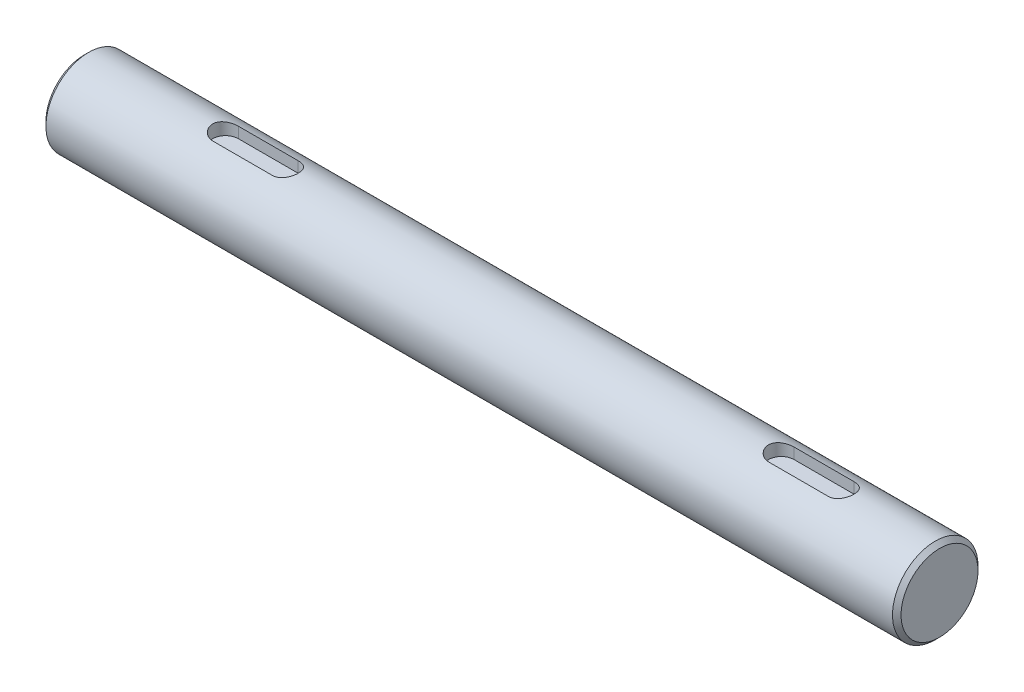
ISO-10303-21;
HEADER;
FILE_DESCRIPTION(('STEP AP214'),'2;1');
FILE_NAME('part.step','',(''),(''),'','','');
FILE_SCHEMA(('AUTOMOTIVE_DESIGN { 1 0 10303 214 1 1 1 1 }'));
ENDSEC;
DATA;
#1=APPLICATION_CONTEXT('core data for automotive mechanical design processes');
#2=APPLICATION_PROTOCOL_DEFINITION('international standard','automotive_design',2000,#1);
#3=PRODUCT_CONTEXT('',#1,'mechanical');
#4=PRODUCT('Part','Part','',(#3));
#5=PRODUCT_RELATED_PRODUCT_CATEGORY('part','',(#4));
#6=PRODUCT_DEFINITION_FORMATION('','',#4);
#7=PRODUCT_DEFINITION_CONTEXT('part definition',#1,'design');
#8=PRODUCT_DEFINITION('design','',#6,#7);
#9=PRODUCT_DEFINITION_SHAPE('','',#8);
#10=(LENGTH_UNIT() NAMED_UNIT(*) SI_UNIT(.MILLI.,.METRE.));
#11=(NAMED_UNIT(*) PLANE_ANGLE_UNIT() SI_UNIT($,.RADIAN.));
#12=(NAMED_UNIT(*) SI_UNIT($,.STERADIAN.) SOLID_ANGLE_UNIT());
#13=UNCERTAINTY_MEASURE_WITH_UNIT(LENGTH_MEASURE(1.E-05),#10,'distance_accuracy_value','');
#14=(GEOMETRIC_REPRESENTATION_CONTEXT(3) GLOBAL_UNCERTAINTY_ASSIGNED_CONTEXT((#13)) GLOBAL_UNIT_ASSIGNED_CONTEXT((#10,
#11,#12)) REPRESENTATION_CONTEXT('',''));
#15=CARTESIAN_POINT('',(0.,0.,0.));
#16=DIRECTION('',(0.,0.,1.));
#17=DIRECTION('',(1.,0.,0.));
#18=AXIS2_PLACEMENT_3D('',#15,#16,#17);
#19=CARTESIAN_POINT('',(200.,0.,0.));
#20=DIRECTION('',(-1.,0.,0.));
#21=DIRECTION('',(0.,0.,1.));
#22=AXIS2_PLACEMENT_3D('',#19,#20,#21);
#23=CYLINDRICAL_SURFACE('',#22,10.);
#24=CARTESIAN_POINT('',(199.,0.,0.));
#25=DIRECTION('',(1.,0.,0.));
#26=DIRECTION('',(0.,0.,-1.));
#27=AXIS2_PLACEMENT_3D('',#24,#25,#26);
#28=CIRCLE('',#27,10.);
#29=CARTESIAN_POINT('',(199.,0.,-10.));
#30=VERTEX_POINT('',#29);
#31=EDGE_CURVE('E11',#30,#30,#28,.F.);
#32=ORIENTED_EDGE('',*,*,#31,.T.);
#33=EDGE_LOOP('',(#32));
#34=FACE_BOUND('',#33,.T.);
#35=DIRECTION('',(-1.,0.,0.));
#36=VECTOR('',#35,1.);
#37=CARTESIAN_POINT('',(200.,9.53939201416946,-3.));
#38=LINE('',#37,#36);
#39=CARTESIAN_POINT('',(163.,9.53939201416946,-3.));
#40=VERTEX_POINT('',#39);
#41=CARTESIAN_POINT('',(177.,9.53939201416946,-3.));
#42=VERTEX_POINT('',#41);
#43=EDGE_CURVE('E214',#40,#42,#38,.F.);
#44=ORIENTED_EDGE('',*,*,#43,.T.);
#45=CARTESIAN_POINT('',(177.,9.53939201416946,3.));
#46=CARTESIAN_POINT('',(176.835610904115,9.5393937145396,2.99999795267528));
#47=CARTESIAN_POINT('',(176.671201551712,9.54368780418137,2.98644216334284));
#48=CARTESIAN_POINT('',(176.347189500816,9.56033156605799,2.93271688893498));
#49=CARTESIAN_POINT('',(176.187588426997,9.57268392986936,2.89253851147156));
#50=CARTESIAN_POINT('',(175.877930543457,9.60392204971265,2.78705506539911));
#51=CARTESIAN_POINT('',(175.727858340734,9.62279693406465,2.72179178788487));
#52=CARTESIAN_POINT('',(175.440756132009,9.66493865095134,2.56812843835859));
#53=CARTESIAN_POINT('',(175.303728082631,9.68820614082039,2.47972490274106));
#54=CARTESIAN_POINT('',(175.042267218845,9.73733724371531,2.27929508283254));
#55=CARTESIAN_POINT('',(174.918308204107,9.76325616623271,2.16666414351614));
#56=CARTESIAN_POINT('',(174.690724097355,9.81429723873514,1.9222724751592));
#57=CARTESIAN_POINT('',(174.5871016191,9.8394192859541,1.79050929092223));
#58=CARTESIAN_POINT('',(174.401074600333,9.88666429158777,1.50822287558739));
#59=CARTESIAN_POINT('',(174.319153151114,9.90871448684808,1.35736804267164));
#60=CARTESIAN_POINT('',(174.182025481914,9.94668871841369,1.04324929073872));
#61=CARTESIAN_POINT('',(174.126813500285,9.96261407578992,0.87998805677583));
#62=CARTESIAN_POINT('',(174.046239997819,9.98615292007178,0.550647705261666));
#63=CARTESIAN_POINT('',(174.020069744695,9.99399114738673,0.38478279790761));
#64=CARTESIAN_POINT('',(173.995765350707,10.001264030027,0.0508436474986367));
#65=CARTESIAN_POINT('',(173.997625321196,10.0007004504217,-0.117230124100733));
#66=CARTESIAN_POINT('',(174.028785737086,9.99139207635305,-0.445142313200301));
#67=CARTESIAN_POINT('',(174.05721038762,9.98290840410476,-0.605072535282645));
#68=CARTESIAN_POINT('',(174.139262671989,9.95903044225231,-0.917778426885062));
#69=CARTESIAN_POINT('',(174.192891901885,9.94363571501341,-1.07055364264576));
#70=CARTESIAN_POINT('',(174.324424046837,9.90730441973756,-1.36669465270246));
#71=CARTESIAN_POINT('',(174.402602405614,9.88630539352773,-1.50993012938862));
#72=CARTESIAN_POINT('',(174.580795704857,9.84099281296778,-1.78152934756661));
#73=CARTESIAN_POINT('',(174.680815825929,9.81667847277943,-1.90988954974543));
#74=CARTESIAN_POINT('',(174.904395501501,9.76623100973852,-2.15332096305836));
#75=CARTESIAN_POINT('',(175.028713838051,9.74006390633502,-2.26768916079756));
#76=CARTESIAN_POINT('',(175.295020035789,9.68967959784414,-2.47415303080115));
#77=CARTESIAN_POINT('',(175.437009650811,9.66546258669242,-2.56624648967452));
#78=CARTESIAN_POINT('',(175.736478938472,9.62155806359712,-2.72627990669512));
#79=CARTESIAN_POINT('',(175.894094091617,9.6019162125849,-2.79397978469378));
#80=CARTESIAN_POINT('',(176.219214416779,9.5699278496379,-2.9016672575074));
#81=CARTESIAN_POINT('',(176.386716343035,9.55757895796639,-2.94166389279494));
#82=CARTESIAN_POINT('',(176.720164721502,9.54209699116239,-2.99149540565762));
#83=CARTESIAN_POINT('',(176.885936447794,9.53863757349917,-3.00239892760807));
#84=CARTESIAN_POINT('',(177.216945800013,9.54042384874812,-2.99671894465741));
#85=CARTESIAN_POINT('',(177.38218349746,9.54566832310787,-2.98013928742559));
#86=CARTESIAN_POINT('',(177.702976755943,9.56395117112153,-2.92091527148479));
#87=CARTESIAN_POINT('',(177.858672328527,9.57678353015602,-2.87895922862587));
#88=CARTESIAN_POINT('',(178.160803381629,9.6085828246183,-2.77097155495853));
#89=CARTESIAN_POINT('',(178.307237428281,9.62755070717977,-2.70493620685513));
#90=CARTESIAN_POINT('',(178.591034928144,9.67011670046268,-2.54863742393009));
#91=CARTESIAN_POINT('',(178.728049441972,9.69382542139644,-2.4577712834546));
#92=CARTESIAN_POINT('',(178.985276212362,9.74296411293927,-2.25510603200768));
#93=CARTESIAN_POINT('',(179.105484435226,9.76839449459993,-2.14330191069794));
#94=CARTESIAN_POINT('',(179.330360811629,9.81927267096329,-1.89691026498723));
#95=CARTESIAN_POINT('',(179.434271257974,9.84468490126011,-1.7616221317149));
#96=CARTESIAN_POINT('',(179.617933402055,9.89169703497297,-1.47492356918053));
#97=CARTESIAN_POINT('',(179.697686299563,9.91329712769432,-1.32351394108792));
#98=CARTESIAN_POINT('',(179.830000061137,9.95011940949915,-1.00987100941047));
#99=CARTESIAN_POINT('',(179.882764032318,9.96538906849931,-0.847729244075695));
#100=CARTESIAN_POINT('',(179.960121837781,9.98803959193653,-0.516339933009185));
#101=CARTESIAN_POINT('',(179.984723731897,9.9954227134176,-0.347094434709533));
#102=CARTESIAN_POINT('',(180.004446088109,10.001330881628,-0.013304307765495));
#103=CARTESIAN_POINT('',(180.000665390816,10.0001861022264,0.151170358172402));
#104=CARTESIAN_POINT('',(179.966356735002,9.98994528930073,0.477038962328796));
#105=CARTESIAN_POINT('',(179.935830293039,9.98084970660925,0.638433074693046));
#106=CARTESIAN_POINT('',(179.849576677201,9.95582336716653,0.951871626082711));
#107=CARTESIAN_POINT('',(179.794123638702,9.93996705801732,1.10399785470278));
#108=CARTESIAN_POINT('',(179.659836170986,9.903058860789,1.3968664755041));
#109=CARTESIAN_POINT('',(179.580997899428,9.88200611899892,1.53760699210115));
#110=CARTESIAN_POINT('',(179.39925308514,9.83607931656457,1.80860378484112));
#111=CARTESIAN_POINT('',(179.295657139998,9.81110453847119,1.93838050015353));
#112=CARTESIAN_POINT('',(179.068579223334,9.76047074424668,2.17907514269189));
#113=CARTESIAN_POINT('',(178.945091524204,9.73481153282158,2.28998761920387));
#114=CARTESIAN_POINT('',(178.677318443379,9.68481361262638,2.49312538789096));
#115=CARTESIAN_POINT('',(178.532522893219,9.66053705386971,2.58469519515911));
#116=CARTESIAN_POINT('',(178.228889651678,9.61705095017586,2.7420862705755));
#117=CARTESIAN_POINT('',(178.070058752798,9.59783897193911,2.80791991114576));
#118=CARTESIAN_POINT('',(177.760519136787,9.56855633435189,2.90603885065899));
#119=CARTESIAN_POINT('',(177.610782706138,9.5577230968104,2.94117718022463));
#120=CARTESIAN_POINT('',(177.307369555008,9.54314085194333,2.98815637670288));
#121=CARTESIAN_POINT('',(177.153693630709,9.53939042442861,3.00000191412191));
#122=CARTESIAN_POINT('',(177.,9.53939201416946,3.));
#123=B_SPLINE_CURVE_WITH_KNOTS('',3,(#45,#46,#47,#48,#49,#50,#51,#52,#53,#54,#55,#56,#57,#58,
#59,#60,#61,#62,#63,#64,#65,#66,#67,#68,#69,#70,#71,#72,#73,#74,#75,#76,#77,#78,#79,#80,#81,#82,
#83,#84,#85,#86,#87,#88,#89,#90,#91,#92,#93,#94,#95,#96,#97,#98,#99,#100,#101,#102,#103,#104,
#105,#106,#107,#108,#109,#110,#111,#112,#113,#114,#115,#116,#117,#118,#119,#120,#121,#122),
.UNSPECIFIED.,.T.,.F.,(4,2,2,2,2,2,2,2,2,2,2,2,2,2,2,2,2,2,2,2,2,2,2,2,2,2,2,2,2,2,2,2,2,2,2,2,
2,2,4),(0.,0.49260033183107,0.985365283377986,1.47731282893238,1.96933405074019,
2.47546300015966,2.98165695742545,3.49831878547288,4.01486911175754,4.51664280299114,
5.01831108202879,5.50400251981758,5.9897247178075,6.4811041867135,6.97260033181659,
7.48304294046556,7.99353624983726,8.50892476494933,9.0241450126203,9.52016161585826,
10.0161087821998,10.4991718988284,10.9823096209678,11.4784146362398,11.9746385186305,
12.4895901220641,13.0045161465361,13.5155078363386,14.0263532464857,14.5175260782765,
15.0086710610072,15.4945419374965,15.9804926898796,16.4819925411418,16.9836370526499,
17.500232793435,18.016579879331,18.477223077201,18.9377739007233),.UNSPECIFIED.);
#124=CARTESIAN_POINT('',(177.,9.53939201416946,3.));
#125=VERTEX_POINT('',#124);
#126=EDGE_CURVE('E229',#42,#125,#123,.T.);
#127=ORIENTED_EDGE('',*,*,#126,.T.);
#128=DIRECTION('',(-1.,0.,0.));
#129=VECTOR('',#128,1.);
#130=CARTESIAN_POINT('',(200.,9.53939201416946,3.));
#131=LINE('',#130,#129);
#132=CARTESIAN_POINT('',(163.,9.53939201416946,3.));
#133=VERTEX_POINT('',#132);
#134=EDGE_CURVE('E385',#125,#133,#131,.T.);
#135=ORIENTED_EDGE('',*,*,#134,.T.);
#136=CARTESIAN_POINT('',(163.,9.53939201416946,3.));
#137=CARTESIAN_POINT('',(162.835610904115,9.5393937145396,2.99999795267528));
#138=CARTESIAN_POINT('',(162.671201551712,9.54368780418137,2.98644216334284));
#139=CARTESIAN_POINT('',(162.347189500816,9.56033156605799,2.93271688893498));
#140=CARTESIAN_POINT('',(162.187588426997,9.57268392986936,2.89253851147156));
#141=CARTESIAN_POINT('',(161.877930543457,9.60392204971265,2.78705506539911));
#142=CARTESIAN_POINT('',(161.727858340734,9.62279693406464,2.72179178788487));
#143=CARTESIAN_POINT('',(161.440756132009,9.66493865095134,2.56812843835859));
#144=CARTESIAN_POINT('',(161.303728082631,9.68820614082039,2.47972490274106));
#145=CARTESIAN_POINT('',(161.042267218845,9.73733724371531,2.27929508283254));
#146=CARTESIAN_POINT('',(160.918308204107,9.76325616623271,2.16666414351613));
#147=CARTESIAN_POINT('',(160.690724097355,9.81429723873514,1.92227247515919));
#148=CARTESIAN_POINT('',(160.5871016191,9.8394192859541,1.79050929092223));
#149=CARTESIAN_POINT('',(160.401074600333,9.88666429158777,1.50822287558739));
#150=CARTESIAN_POINT('',(160.319153151114,9.90871448684808,1.35736804267163));
#151=CARTESIAN_POINT('',(160.182025481914,9.94668871841369,1.04324929073871));
#152=CARTESIAN_POINT('',(160.126813500285,9.96261407578992,0.879988056775827));
#153=CARTESIAN_POINT('',(160.046239997819,9.98615292007178,0.550647705261666));
#154=CARTESIAN_POINT('',(160.020069744695,9.99399114738673,0.38478279790761));
#155=CARTESIAN_POINT('',(159.995765350707,10.001264030027,0.0508436474986367));
#156=CARTESIAN_POINT('',(159.997625321196,10.0007004504217,-0.117230124100733));
#157=CARTESIAN_POINT('',(160.028785737086,9.99139207635305,-0.445142313200301));
#158=CARTESIAN_POINT('',(160.05721038762,9.98290840410476,-0.605072535282646));
#159=CARTESIAN_POINT('',(160.139262671989,9.95903044225231,-0.917778426885062));
#160=CARTESIAN_POINT('',(160.192891901885,9.94363571501341,-1.07055364264576));
#161=CARTESIAN_POINT('',(160.324424046837,9.90730441973756,-1.36669465270247));
#162=CARTESIAN_POINT('',(160.402602405614,9.88630539352772,-1.50993012938863));
#163=CARTESIAN_POINT('',(160.580795704857,9.84099281296778,-1.78152934756662));
#164=CARTESIAN_POINT('',(160.680815825929,9.81667847277943,-1.90988954974543));
#165=CARTESIAN_POINT('',(160.904395501501,9.76623100973852,-2.15332096305836));
#166=CARTESIAN_POINT('',(161.028713838051,9.74006390633503,-2.26768916079754));
#167=CARTESIAN_POINT('',(161.295020035789,9.68967959784414,-2.47415303080114));
#168=CARTESIAN_POINT('',(161.437009650811,9.66546258669242,-2.56624648967452));
#169=CARTESIAN_POINT('',(161.736478938472,9.62155806359712,-2.72627990669512));
#170=CARTESIAN_POINT('',(161.894094091618,9.6019162125849,-2.79397978469378));
#171=CARTESIAN_POINT('',(162.219214416779,9.5699278496379,-2.9016672575074));
#172=CARTESIAN_POINT('',(162.386716343035,9.55757895796639,-2.94166389279494));
#173=CARTESIAN_POINT('',(162.720164721502,9.54209699116239,-2.99149540565762));
#174=CARTESIAN_POINT('',(162.885936447794,9.53863757349917,-3.00239892760807));
#175=CARTESIAN_POINT('',(163.216945800013,9.54042384874812,-2.99671894465741));
#176=CARTESIAN_POINT('',(163.38218349746,9.54566832310787,-2.98013928742559));
#177=CARTESIAN_POINT('',(163.702976755943,9.56395117112154,-2.92091527148479));
#178=CARTESIAN_POINT('',(163.858672328527,9.57678353015602,-2.87895922862586));
#179=CARTESIAN_POINT('',(164.160803381629,9.6085828246183,-2.77097155495853));
#180=CARTESIAN_POINT('',(164.307237428281,9.62755070717977,-2.70493620685512));
#181=CARTESIAN_POINT('',(164.591034928144,9.67011670046268,-2.54863742393009));
#182=CARTESIAN_POINT('',(164.728049441972,9.69382542139644,-2.4577712834546));
#183=CARTESIAN_POINT('',(164.985276212362,9.74296411293927,-2.25510603200768));
#184=CARTESIAN_POINT('',(165.105484435226,9.76839449459993,-2.14330191069794));
#185=CARTESIAN_POINT('',(165.330360811629,9.81927267096329,-1.89691026498722));
#186=CARTESIAN_POINT('',(165.434271257974,9.84468490126011,-1.76162213171488));
#187=CARTESIAN_POINT('',(165.617933402056,9.89169703497298,-1.4749235691805));
#188=CARTESIAN_POINT('',(165.697686299563,9.91329712769433,-1.32351394108789));
#189=CARTESIAN_POINT('',(165.830000061137,9.95011940949916,-1.00987100941044));
#190=CARTESIAN_POINT('',(165.882764032318,9.96538906849931,-0.847729244075674));
#191=CARTESIAN_POINT('',(165.960121837781,9.98803959193653,-0.516339933009177));
#192=CARTESIAN_POINT('',(165.984723731897,9.9954227134176,-0.347094434709529));
#193=CARTESIAN_POINT('',(166.004446088109,10.001330881628,-0.0133043077654937));
#194=CARTESIAN_POINT('',(166.000665390816,10.0001861022264,0.151170358172403));
#195=CARTESIAN_POINT('',(165.966356735002,9.98994528930073,0.477038962328795));
#196=CARTESIAN_POINT('',(165.935830293039,9.98084970660925,0.638433074693044));
#197=CARTESIAN_POINT('',(165.849576677201,9.95582336716653,0.951871626082701));
#198=CARTESIAN_POINT('',(165.794123638702,9.93996705801732,1.10399785470277));
#199=CARTESIAN_POINT('',(165.659836170986,9.903058860789,1.39686647550409));
#200=CARTESIAN_POINT('',(165.580997899428,9.88200611899893,1.53760699210114));
#201=CARTESIAN_POINT('',(165.39925308514,9.83607931656457,1.80860378484112));
#202=CARTESIAN_POINT('',(165.295657139998,9.81110453847119,1.93838050015353));
#203=CARTESIAN_POINT('',(165.068579223334,9.76047074424668,2.17907514269189));
#204=CARTESIAN_POINT('',(164.945091524204,9.73481153282158,2.28998761920386));
#205=CARTESIAN_POINT('',(164.677318443379,9.68481361262638,2.49312538789097));
#206=CARTESIAN_POINT('',(164.532522893219,9.66053705386971,2.58469519515912));
#207=CARTESIAN_POINT('',(164.228889651678,9.61705095017586,2.74208627057551));
#208=CARTESIAN_POINT('',(164.070058752798,9.59783897193911,2.80791991114577));
#209=CARTESIAN_POINT('',(163.760519136787,9.56855633435189,2.90603885065898));
#210=CARTESIAN_POINT('',(163.610782706138,9.5577230968104,2.94117718022463));
#211=CARTESIAN_POINT('',(163.307369555008,9.54314085194333,2.98815637670288));
#212=CARTESIAN_POINT('',(163.15369363071,9.53939042442861,3.00000191412191));
#213=CARTESIAN_POINT('',(163.,9.53939201416946,3.));
#214=B_SPLINE_CURVE_WITH_KNOTS('',3,(#136,#137,#138,#139,#140,#141,#142,#143,#144,#145,#146,
#147,#148,#149,#150,#151,#152,#153,#154,#155,#156,#157,#158,#159,#160,#161,#162,#163,#164,#165,
#166,#167,#168,#169,#170,#171,#172,#173,#174,#175,#176,#177,#178,#179,#180,#181,#182,#183,#184,
#185,#186,#187,#188,#189,#190,#191,#192,#193,#194,#195,#196,#197,#198,#199,#200,#201,#202,#203,
#204,#205,#206,#207,#208,#209,#210,#211,#212,#213),.UNSPECIFIED.,.T.,.F.,(4,2,2,2,2,2,2,2,2,2,2,
2,2,2,2,2,2,2,2,2,2,2,2,2,2,2,2,2,2,2,2,2,2,2,2,2,2,2,4),(0.,0.49260033183107,0.985365283377986,
1.47731282893238,1.96933405074019,2.47546300015969,2.98165695742545,3.49831878547289,
4.01486911175754,4.51664280299114,5.01831108202879,5.50400251981759,5.9897247178075,
6.48110418671351,6.97260033181659,7.48304294046555,7.99353624983726,8.50892476494933,
9.0241450126203,9.52016161585826,10.0161087821998,10.4991718988284,10.9823096209678,
11.4784146362398,11.9746385186305,12.4895901220641,13.0045161465361,13.5155078363386,
14.0263532464857,14.5175260782765,15.0086710610072,15.4945419374964,15.9804926898796,
16.4819925411418,16.9836370526499,17.500232793435,18.016579879331,18.477223077201,
18.9377739007233),.UNSPECIFIED.);
#215=EDGE_CURVE('E59',#133,#40,#214,.T.);
#216=ORIENTED_EDGE('',*,*,#215,.T.);
#217=EDGE_LOOP('',(#44,#127,#135,#216));
#218=FACE_BOUND('',#217,.T.);
#219=CARTESIAN_POINT('',(0.999999999999973,0.,0.));
#220=DIRECTION('',(1.,0.,0.));
#221=DIRECTION('',(0.,0.,-1.));
#222=AXIS2_PLACEMENT_3D('',#219,#220,#221);
#223=CIRCLE('',#222,10.);
#224=CARTESIAN_POINT('',(0.999999999999973,0.,-10.));
#225=VERTEX_POINT('',#224);
#226=EDGE_CURVE('E218',#225,#225,#223,.T.);
#227=ORIENTED_EDGE('',*,*,#226,.T.);
#228=EDGE_LOOP('',(#227));
#229=FACE_BOUND('',#228,.T.);
#230=DIRECTION('',(-1.,0.,0.));
#231=VECTOR('',#230,1.);
#232=CARTESIAN_POINT('',(200.,9.53939201416946,-3.));
#233=LINE('',#232,#231);
#234=CARTESIAN_POINT('',(33.,9.53939201416946,-3.));
#235=VERTEX_POINT('',#234);
#236=CARTESIAN_POINT('',(47.,9.53939201416946,-3.));
#237=VERTEX_POINT('',#236);
#238=EDGE_CURVE('E220',#235,#237,#233,.F.);
#239=ORIENTED_EDGE('',*,*,#238,.T.);
#240=CARTESIAN_POINT('',(47.,9.53939201416946,-3.));
#241=CARTESIAN_POINT('',(47.0823355208227,9.53938054248207,-3.00001027845728));
#242=CARTESIAN_POINT('',(47.1646644550632,9.54045772064378,-2.99661062684472));
#243=CARTESIAN_POINT('',(47.3286939527655,9.54470412105986,-2.98307142899347));
#244=CARTESIAN_POINT('',(47.4103946533244,9.54787287296848,-2.97293339805418));
#245=CARTESIAN_POINT('',(47.5723849156732,9.55620668351003,-2.94603140625045));
#246=CARTESIAN_POINT('',(47.652677524043,9.56136667250114,-2.92928426957737));
#247=CARTESIAN_POINT('',(47.8114758441342,9.57351626651178,-2.88932853030394));
#248=CARTESIAN_POINT('',(47.8899815090674,9.58050591937828,-2.8661197587264));
#249=CARTESIAN_POINT('',(48.1219493879901,9.60391637654137,-2.78708584446024));
#250=CARTESIAN_POINT('',(48.272068438833,9.62279007830391,-2.72181852542972));
#251=CARTESIAN_POINT('',(48.559226043979,9.66493213967819,-2.56815043531276));
#252=CARTESIAN_POINT('',(48.6962584707622,9.68820254290641,-2.47973889924159));
#253=CARTESIAN_POINT('',(48.9577229879478,9.73733650515374,-2.27929879634442));
#254=CARTESIAN_POINT('',(49.0816848740609,9.76325505469874,-2.16666914746584));
#255=CARTESIAN_POINT('',(49.3092736148388,9.81429628475077,-1.92227736150433));
#256=CARTESIAN_POINT('',(49.412897033861,9.8394188301941,-1.79051199848164));
#257=CARTESIAN_POINT('',(49.5989268650946,9.88666477976534,-1.50821997465697));
#258=CARTESIAN_POINT('',(49.6808501797826,9.90871541546877,-1.35736167401016));
#259=CARTESIAN_POINT('',(49.8179770040029,9.94668940088144,-1.04324233568303));
#260=CARTESIAN_POINT('',(49.873187403368,9.96261433032403,-0.879984508687984));
#261=CARTESIAN_POINT('',(49.953759551791,9.98615279768398,-0.550649404820599));
#262=CARTESIAN_POINT('',(49.9799297035176,9.99399098526792,-0.384786253016201));
#263=CARTESIAN_POINT('',(50.004234695146,10.0012640407204,-0.0508471415689267));
#264=CARTESIAN_POINT('',(50.0023748426782,10.0007004995012,0.11722839312534));
#265=CARTESIAN_POINT('',(49.9712141793086,9.99139205125586,0.445143199271826));
#266=CARTESIAN_POINT('',(49.9427893091919,9.98290831016512,0.605074290763031));
#267=CARTESIAN_POINT('',(49.8607367303745,9.95903027401822,0.917780104370317));
#268=CARTESIAN_POINT('',(49.8071077013173,9.94363561692558,1.07055445110879));
#269=CARTESIAN_POINT('',(49.6755755564752,9.90730429851782,1.36669563173912));
#270=CARTESIAN_POINT('',(49.5973967112239,9.88630511384915,1.50993201207613));
#271=CARTESIAN_POINT('',(49.4192028199656,9.84099249303646,1.78153105916101));
#272=CARTESIAN_POINT('',(49.3191828810593,9.81667831471806,1.90989038323251));
#273=CARTESIAN_POINT('',(49.0956160238154,9.7662334714278,2.15330901082206));
#274=CARTESIAN_POINT('',(48.9713122724738,9.74006890899097,2.26766702955976));
#275=CARTESIAN_POINT('',(48.7050051531489,9.68968430229327,2.47413538985067));
#276=CARTESIAN_POINT('',(48.5629966392702,9.66546482675134,2.5662392402618));
#277=CARTESIAN_POINT('',(48.2634381431001,9.62154457591303,2.72632814481702));
#278=CARTESIAN_POINT('',(48.1057456408129,9.60189192491895,2.79406012682263));
#279=CARTESIAN_POINT('',(47.7805509920368,9.56991327306402,2.90171772009405));
#280=CARTESIAN_POINT('',(47.6130642785713,9.55757606951749,2.94168586436072));
#281=CARTESIAN_POINT('',(47.3700102218596,9.54628064650012,2.97802407180159));
#282=CARTESIAN_POINT('',(47.2962185316408,9.54370312550533,2.98626405978017));
#283=CARTESIAN_POINT('',(47.148297041801,9.54025857223564,2.99724711229708));
#284=CARTESIAN_POINT('',(47.0741679006723,9.53938902493288,2.99999825936538));
#285=CARTESIAN_POINT('',(47.,9.53939201416946,3.));
#286=B_SPLINE_CURVE_WITH_KNOTS('',3,(#240,#241,#242,#243,#244,#245,#246,#247,#248,#249,#250,
#251,#252,#253,#254,#255,#256,#257,#258,#259,#260,#261,#262,#263,#264,#265,#266,#267,#268,#269,
#270,#271,#272,#273,#274,#275,#276,#277,#278,#279,#280,#281,#282,#283,#284,#285),.UNSPECIFIED.,
.F.,.F.,(4,2,2,2,2,2,2,2,2,2,2,2,2,2,2,2,2,2,2,2,2,2,4),(0.,0.246918142439467,0.493780777706094,
0.740019009623013,0.986263681482027,1.47813347402026,1.97023245590779,2.47635119822766,
2.98255536239032,3.4992281062007,4.01576751791672,4.51753600864764,5.01920948804101,
5.50490358251093,5.99062312360831,6.48200583350621,6.9734987373917,7.48389234847122,
7.99443465298715,8.51013494368214,9.02504345105574,9.24774267716777,9.47011372732391),.UNSPECIFIED.);
#287=CARTESIAN_POINT('',(47.,9.53939201416946,3.));
#288=VERTEX_POINT('',#287);
#289=EDGE_CURVE('E156',#237,#288,#286,.T.);
#290=ORIENTED_EDGE('',*,*,#289,.T.);
#291=DIRECTION('',(-1.,0.,0.));
#292=VECTOR('',#291,1.);
#293=CARTESIAN_POINT('',(200.,9.53939201416946,3.));
#294=LINE('',#293,#292);
#295=CARTESIAN_POINT('',(33.,9.53939201416946,3.));
#296=VERTEX_POINT('',#295);
#297=EDGE_CURVE('E223',#288,#296,#294,.T.);
#298=ORIENTED_EDGE('',*,*,#297,.T.);
#299=CARTESIAN_POINT('',(33.,9.53939201416946,3.));
#300=CARTESIAN_POINT('',(32.9176644791773,9.53938054248207,3.00001027845728));
#301=CARTESIAN_POINT('',(32.8353355449368,9.54045772064378,2.99661062684472));
#302=CARTESIAN_POINT('',(32.6713060472345,9.54470412105986,2.98307142899347));
#303=CARTESIAN_POINT('',(32.5896053466756,9.54787287296849,2.97293339805418));
#304=CARTESIAN_POINT('',(32.4276150843268,9.55620668351003,2.94603140625045));
#305=CARTESIAN_POINT('',(32.347322475957,9.56136667250114,2.92928426957737));
#306=CARTESIAN_POINT('',(32.1885241558658,9.57351626651178,2.88932853030395));
#307=CARTESIAN_POINT('',(32.1100184909326,9.58050591937828,2.8661197587264));
#308=CARTESIAN_POINT('',(31.8780506120099,9.60391637654137,2.78708584446024));
#309=CARTESIAN_POINT('',(31.727931561167,9.62279007830391,2.72181852542972));
#310=CARTESIAN_POINT('',(31.440773956021,9.66493213967819,2.56815043531276));
#311=CARTESIAN_POINT('',(31.3037415292378,9.6882025429064,2.4797388992416));
#312=CARTESIAN_POINT('',(31.0422770120522,9.73733650515374,2.27929879634442));
#313=CARTESIAN_POINT('',(30.9183151259391,9.76325505469874,2.16666914746584));
#314=CARTESIAN_POINT('',(30.6907263851612,9.81429628475077,1.92227736150433));
#315=CARTESIAN_POINT('',(30.587102966139,9.8394188301941,1.79051199848164));
#316=CARTESIAN_POINT('',(30.4010731349054,9.88666477976534,1.50821997465697));
#317=CARTESIAN_POINT('',(30.3191498202174,9.90871541546877,1.35736167401016));
#318=CARTESIAN_POINT('',(30.1820229959971,9.94668940088144,1.04324233568303));
#319=CARTESIAN_POINT('',(30.126812596632,9.96261433032403,0.879984508687984));
#320=CARTESIAN_POINT('',(30.046240448209,9.98615279768398,0.550649404820601));
#321=CARTESIAN_POINT('',(30.0200702964824,9.99399098526792,0.384786253016202));
#322=CARTESIAN_POINT('',(29.995765304854,10.0012640407204,0.0508471415689262));
#323=CARTESIAN_POINT('',(29.9976251573218,10.0007004995012,-0.117228393125341));
#324=CARTESIAN_POINT('',(30.0287858206914,9.99139205125586,-0.445143199271826));
#325=CARTESIAN_POINT('',(30.0572106908081,9.98290831016512,-0.60507429076303));
#326=CARTESIAN_POINT('',(30.1392632696255,9.95903027401822,-0.917780104370316));
#327=CARTESIAN_POINT('',(30.1928922986827,9.94363561692558,-1.07055445110879));
#328=CARTESIAN_POINT('',(30.3244244435248,9.90730429851782,-1.36669563173912));
#329=CARTESIAN_POINT('',(30.4026032887761,9.88630511384915,-1.50993201207613));
#330=CARTESIAN_POINT('',(30.5807971800344,9.84099249303646,-1.781531059161));
#331=CARTESIAN_POINT('',(30.6808171189407,9.81667831471806,-1.90989038323251));
#332=CARTESIAN_POINT('',(30.9043839761846,9.7662334714278,-2.15330901082206));
#333=CARTESIAN_POINT('',(31.0286877275262,9.74006890899097,-2.26766702955976));
#334=CARTESIAN_POINT('',(31.2949948468511,9.68968430229327,-2.47413538985067));
#335=CARTESIAN_POINT('',(31.4370033607298,9.66546482675134,-2.5662392402618));
#336=CARTESIAN_POINT('',(31.7365618568999,9.62154457591303,-2.72632814481701));
#337=CARTESIAN_POINT('',(31.8942543591871,9.60189192491895,-2.79406012682262));
#338=CARTESIAN_POINT('',(32.2194490079631,9.56991327306402,-2.90171772009404));
#339=CARTESIAN_POINT('',(32.3869357214287,9.55757606951749,-2.94168586436072));
#340=CARTESIAN_POINT('',(32.6299897781404,9.54628064650012,-2.97802407180159));
#341=CARTESIAN_POINT('',(32.7037814683592,9.54370312550533,-2.98626405978017));
#342=CARTESIAN_POINT('',(32.8517029581991,9.54025857223564,-2.99724711229709));
#343=CARTESIAN_POINT('',(32.9258320993277,9.53938902493288,-2.99999825936538));
#344=CARTESIAN_POINT('',(33.,9.53939201416946,-3.));
#345=B_SPLINE_CURVE_WITH_KNOTS('',3,(#299,#300,#301,#302,#303,#304,#305,#306,#307,#308,#309,
#310,#311,#312,#313,#314,#315,#316,#317,#318,#319,#320,#321,#322,#323,#324,#325,#326,#327,#328,
#329,#330,#331,#332,#333,#334,#335,#336,#337,#338,#339,#340,#341,#342,#343,#344),.UNSPECIFIED.,
.F.,.F.,(4,2,2,2,2,2,2,2,2,2,2,2,2,2,2,2,2,2,2,2,2,2,4),(0.,0.246918142439467,0.493780777706094,
0.74001900962302,0.986263681482027,1.47813347402026,1.97023245590779,2.47635119822766,
2.98255536239033,3.49922810620071,4.01576751791672,4.51753600864764,5.01920948804101,
5.50490358251093,5.99062312360832,6.48200583350621,6.9734987373917,7.48389234847122,
7.99443465298715,8.51013494368213,9.02504345105574,9.24774267716779,9.47011372732391),.UNSPECIFIED.);
#346=EDGE_CURVE('E67',#296,#235,#345,.T.);
#347=ORIENTED_EDGE('',*,*,#346,.T.);
#348=EDGE_LOOP('',(#239,#290,#298,#347));
#349=FACE_BOUND('',#348,.T.);
#350=ADVANCED_FACE('F43',(#34,#218,#229,#349),#23,.T.);
#351=CARTESIAN_POINT('',(200.,0.,0.));
#352=DIRECTION('',(1.,0.,0.));
#353=DIRECTION('',(0.,0.,-1.));
#354=AXIS2_PLACEMENT_3D('',#351,#352,#353);
#355=PLANE('',#354);
#356=CARTESIAN_POINT('',(200.,0.,0.));
#357=DIRECTION('',(1.,0.,0.));
#358=DIRECTION('',(0.,0.,-1.));
#359=AXIS2_PLACEMENT_3D('',#356,#357,#358);
#360=CIRCLE('',#359,9.00000000000004);
#361=CARTESIAN_POINT('',(200.,0.,-9.00000000000004));
#362=VERTEX_POINT('',#361);
#363=EDGE_CURVE('E52',#362,#362,#360,.T.);
#364=ORIENTED_EDGE('',*,*,#363,.T.);
#365=EDGE_LOOP('',(#364));
#366=FACE_BOUND('',#365,.T.);
#367=ADVANCED_FACE('F197',(#366),#355,.T.);
#368=CARTESIAN_POINT('',(0.,0.,0.));
#369=DIRECTION('',(1.,0.,0.));
#370=DIRECTION('',(0.,0.,-1.));
#371=AXIS2_PLACEMENT_3D('',#368,#369,#370);
#372=PLANE('',#371);
#373=CARTESIAN_POINT('',(0.,0.,0.));
#374=DIRECTION('',(1.,0.,0.));
#375=DIRECTION('',(0.,0.,-1.));
#376=AXIS2_PLACEMENT_3D('',#373,#374,#375);
#377=CIRCLE('',#376,8.99999999999998);
#378=CARTESIAN_POINT('',(0.,0.,-8.99999999999998));
#379=VERTEX_POINT('',#378);
#380=EDGE_CURVE('E225',#379,#379,#377,.F.);
#381=ORIENTED_EDGE('',*,*,#380,.T.);
#382=EDGE_LOOP('',(#381));
#383=FACE_BOUND('',#382,.T.);
#384=ADVANCED_FACE('F196',(#383),#372,.F.);
#385=CARTESIAN_POINT('',(33.,7.,0.));
#386=DIRECTION('',(0.,1.,0.));
#387=DIRECTION('',(0.,0.,1.));
#388=AXIS2_PLACEMENT_3D('',#385,#386,#387);
#389=CYLINDRICAL_SURFACE('',#388,3.);
#390=DIRECTION('',(0.,1.,0.));
#391=VECTOR('',#390,1.);
#392=CARTESIAN_POINT('',(33.,7.,3.));
#393=LINE('',#392,#391);
#394=CARTESIAN_POINT('',(33.,7.,3.));
#395=VERTEX_POINT('',#394);
#396=EDGE_CURVE('E153',#395,#296,#393,.T.);
#397=ORIENTED_EDGE('',*,*,#396,.F.);
#398=CARTESIAN_POINT('',(33.,7.,0.));
#399=DIRECTION('',(0.,1.,0.));
#400=DIRECTION('',(0.,0.,1.));
#401=AXIS2_PLACEMENT_3D('',#398,#399,#400);
#402=CIRCLE('',#401,3.);
#403=CARTESIAN_POINT('',(33.,7.,-3.));
#404=VERTEX_POINT('',#403);
#405=EDGE_CURVE('E137',#404,#395,#402,.T.);
#406=ORIENTED_EDGE('',*,*,#405,.F.);
#407=DIRECTION('',(0.,1.,0.));
#408=VECTOR('',#407,1.);
#409=CARTESIAN_POINT('',(33.,7.,-3.));
#410=LINE('',#409,#408);
#411=EDGE_CURVE('E154',#404,#235,#410,.T.);
#412=ORIENTED_EDGE('',*,*,#411,.T.);
#413=ORIENTED_EDGE('',*,*,#346,.F.);
#414=EDGE_LOOP('',(#397,#406,#412,#413));
#415=FACE_BOUND('',#414,.T.);
#416=ADVANCED_FACE('F192',(#415),#389,.F.);
#417=CARTESIAN_POINT('',(33.,7.,-3.));
#418=DIRECTION('',(0.,0.,-1.));
#419=DIRECTION('',(-1.,0.,0.));
#420=AXIS2_PLACEMENT_3D('',#417,#418,#419);
#421=PLANE('',#420);
#422=ORIENTED_EDGE('',*,*,#411,.F.);
#423=DIRECTION('',(-1.,0.,0.));
#424=VECTOR('',#423,1.);
#425=CARTESIAN_POINT('',(33.,7.,-3.));
#426=LINE('',#425,#424);
#427=CARTESIAN_POINT('',(47.,7.,-3.));
#428=VERTEX_POINT('',#427);
#429=EDGE_CURVE('E150',#428,#404,#426,.T.);
#430=ORIENTED_EDGE('',*,*,#429,.F.);
#431=DIRECTION('',(0.,1.,0.));
#432=VECTOR('',#431,1.);
#433=CARTESIAN_POINT('',(47.,7.,-3.));
#434=LINE('',#433,#432);
#435=EDGE_CURVE('E157',#428,#237,#434,.T.);
#436=ORIENTED_EDGE('',*,*,#435,.T.);
#437=ORIENTED_EDGE('',*,*,#238,.F.);
#438=EDGE_LOOP('',(#422,#430,#436,#437));
#439=FACE_BOUND('',#438,.T.);
#440=ADVANCED_FACE('F186',(#439),#421,.F.);
#441=CARTESIAN_POINT('',(47.,7.,0.));
#442=DIRECTION('',(0.,1.,0.));
#443=DIRECTION('',(0.,0.,1.));
#444=AXIS2_PLACEMENT_3D('',#441,#442,#443);
#445=CYLINDRICAL_SURFACE('',#444,3.);
#446=ORIENTED_EDGE('',*,*,#435,.F.);
#447=CARTESIAN_POINT('',(47.,7.,0.));
#448=DIRECTION('',(0.,1.,0.));
#449=DIRECTION('',(0.,0.,-1.));
#450=AXIS2_PLACEMENT_3D('',#447,#448,#449);
#451=CIRCLE('',#450,3.);
#452=CARTESIAN_POINT('',(47.,7.,3.));
#453=VERTEX_POINT('',#452);
#454=EDGE_CURVE('E147',#453,#428,#451,.T.);
#455=ORIENTED_EDGE('',*,*,#454,.F.);
#456=DIRECTION('',(0.,1.,0.));
#457=VECTOR('',#456,1.);
#458=CARTESIAN_POINT('',(47.,7.,3.));
#459=LINE('',#458,#457);
#460=EDGE_CURVE('E160',#453,#288,#459,.T.);
#461=ORIENTED_EDGE('',*,*,#460,.T.);
#462=ORIENTED_EDGE('',*,*,#289,.F.);
#463=EDGE_LOOP('',(#446,#455,#461,#462));
#464=FACE_BOUND('',#463,.T.);
#465=ADVANCED_FACE('F180',(#464),#445,.F.);
#466=CARTESIAN_POINT('',(33.,7.,3.));
#467=DIRECTION('',(0.,0.,1.));
#468=DIRECTION('',(1.,0.,0.));
#469=AXIS2_PLACEMENT_3D('',#466,#467,#468);
#470=PLANE('',#469);
#471=ORIENTED_EDGE('',*,*,#460,.F.);
#472=DIRECTION('',(1.,0.,0.));
#473=VECTOR('',#472,1.);
#474=CARTESIAN_POINT('',(33.,7.,3.));
#475=LINE('',#474,#473);
#476=EDGE_CURVE('E144',#395,#453,#475,.T.);
#477=ORIENTED_EDGE('',*,*,#476,.F.);
#478=ORIENTED_EDGE('',*,*,#396,.T.);
#479=ORIENTED_EDGE('',*,*,#297,.F.);
#480=EDGE_LOOP('',(#471,#477,#478,#479));
#481=FACE_BOUND('',#480,.T.);
#482=ADVANCED_FACE('F185',(#481),#470,.F.);
#483=CARTESIAN_POINT('',(33.,7.,0.));
#484=DIRECTION('',(0.,1.,0.));
#485=DIRECTION('',(0.,0.,1.));
#486=AXIS2_PLACEMENT_3D('',#483,#484,#485);
#487=PLANE('',#486);
#488=ORIENTED_EDGE('',*,*,#405,.T.);
#489=ORIENTED_EDGE('',*,*,#476,.T.);
#490=ORIENTED_EDGE('',*,*,#454,.T.);
#491=ORIENTED_EDGE('',*,*,#429,.T.);
#492=EDGE_LOOP('',(#488,#489,#490,#491));
#493=FACE_BOUND('',#492,.T.);
#494=ADVANCED_FACE('F190',(#493),#487,.T.);
#495=CARTESIAN_POINT('',(0.999999999999973,0.,0.));
#496=DIRECTION('',(1.,0.,0.));
#497=DIRECTION('',(0.,0.,-1.));
#498=AXIS2_PLACEMENT_3D('',#495,#496,#497);
#499=CONICAL_SURFACE('',#498,10.,0.785398163397472);
#500=ORIENTED_EDGE('',*,*,#380,.F.);
#501=EDGE_LOOP('',(#500));
#502=FACE_BOUND('',#501,.T.);
#503=ORIENTED_EDGE('',*,*,#226,.F.);
#504=EDGE_LOOP('',(#503));
#505=FACE_BOUND('',#504,.T.);
#506=ADVANCED_FACE('F251',(#502,#505),#499,.T.);
#507=CARTESIAN_POINT('',(163.,7.,0.));
#508=DIRECTION('',(0.,1.,0.));
#509=DIRECTION('',(0.,0.,1.));
#510=AXIS2_PLACEMENT_3D('',#507,#508,#509);
#511=CYLINDRICAL_SURFACE('',#510,3.);
#512=DIRECTION('',(0.,1.,0.));
#513=VECTOR('',#512,1.);
#514=CARTESIAN_POINT('',(163.,7.,3.));
#515=LINE('',#514,#513);
#516=CARTESIAN_POINT('',(163.,7.,3.));
#517=VERTEX_POINT('',#516);
#518=EDGE_CURVE('E109',#517,#133,#515,.T.);
#519=ORIENTED_EDGE('',*,*,#518,.F.);
#520=CARTESIAN_POINT('',(163.,7.,0.));
#521=DIRECTION('',(0.,1.,0.));
#522=DIRECTION('',(0.,0.,1.));
#523=AXIS2_PLACEMENT_3D('',#520,#521,#522);
#524=CIRCLE('',#523,3.);
#525=CARTESIAN_POINT('',(163.,7.,-3.));
#526=VERTEX_POINT('',#525);
#527=EDGE_CURVE('E113',#526,#517,#524,.T.);
#528=ORIENTED_EDGE('',*,*,#527,.F.);
#529=DIRECTION('',(0.,1.,0.));
#530=VECTOR('',#529,1.);
#531=CARTESIAN_POINT('',(163.,7.,-3.));
#532=LINE('',#531,#530);
#533=EDGE_CURVE('E135',#526,#40,#532,.T.);
#534=ORIENTED_EDGE('',*,*,#533,.T.);
#535=ORIENTED_EDGE('',*,*,#215,.F.);
#536=EDGE_LOOP('',(#519,#528,#534,#535));
#537=FACE_BOUND('',#536,.T.);
#538=ADVANCED_FACE('F111',(#537),#511,.F.);
#539=CARTESIAN_POINT('',(163.,7.,-3.));
#540=DIRECTION('',(0.,0.,-1.));
#541=DIRECTION('',(-1.,0.,0.));
#542=AXIS2_PLACEMENT_3D('',#539,#540,#541);
#543=PLANE('',#542);
#544=ORIENTED_EDGE('',*,*,#533,.F.);
#545=DIRECTION('',(-1.,0.,0.));
#546=VECTOR('',#545,1.);
#547=CARTESIAN_POINT('',(163.,7.,-3.));
#548=LINE('',#547,#546);
#549=CARTESIAN_POINT('',(177.,7.,-3.));
#550=VERTEX_POINT('',#549);
#551=EDGE_CURVE('E118',#550,#526,#548,.T.);
#552=ORIENTED_EDGE('',*,*,#551,.F.);
#553=DIRECTION('',(0.,1.,0.));
#554=VECTOR('',#553,1.);
#555=CARTESIAN_POINT('',(177.,7.,-3.));
#556=LINE('',#555,#554);
#557=EDGE_CURVE('E138',#550,#42,#556,.T.);
#558=ORIENTED_EDGE('',*,*,#557,.T.);
#559=ORIENTED_EDGE('',*,*,#43,.F.);
#560=EDGE_LOOP('',(#544,#552,#558,#559));
#561=FACE_BOUND('',#560,.T.);
#562=ADVANCED_FACE('F245',(#561),#543,.F.);
#563=CARTESIAN_POINT('',(177.,7.,0.));
#564=DIRECTION('',(0.,1.,0.));
#565=DIRECTION('',(0.,0.,1.));
#566=AXIS2_PLACEMENT_3D('',#563,#564,#565);
#567=CYLINDRICAL_SURFACE('',#566,3.);
#568=ORIENTED_EDGE('',*,*,#557,.F.);
#569=CARTESIAN_POINT('',(177.,7.,0.));
#570=DIRECTION('',(0.,1.,0.));
#571=DIRECTION('',(0.,0.,-1.));
#572=AXIS2_PLACEMENT_3D('',#569,#570,#571);
#573=CIRCLE('',#572,3.);
#574=CARTESIAN_POINT('',(177.,7.,3.));
#575=VERTEX_POINT('',#574);
#576=EDGE_CURVE('E127',#575,#550,#573,.T.);
#577=ORIENTED_EDGE('',*,*,#576,.F.);
#578=DIRECTION('',(0.,1.,0.));
#579=VECTOR('',#578,1.);
#580=CARTESIAN_POINT('',(177.,7.,3.));
#581=LINE('',#580,#579);
#582=EDGE_CURVE('E117',#575,#125,#581,.T.);
#583=ORIENTED_EDGE('',*,*,#582,.T.);
#584=ORIENTED_EDGE('',*,*,#126,.F.);
#585=EDGE_LOOP('',(#568,#577,#583,#584));
#586=FACE_BOUND('',#585,.T.);
#587=ADVANCED_FACE('F240',(#586),#567,.F.);
#588=CARTESIAN_POINT('',(163.,7.,3.));
#589=DIRECTION('',(0.,0.,1.));
#590=DIRECTION('',(1.,0.,0.));
#591=AXIS2_PLACEMENT_3D('',#588,#589,#590);
#592=PLANE('',#591);
#593=ORIENTED_EDGE('',*,*,#582,.F.);
#594=DIRECTION('',(1.,0.,0.));
#595=VECTOR('',#594,1.);
#596=CARTESIAN_POINT('',(163.,7.,3.));
#597=LINE('',#596,#595);
#598=EDGE_CURVE('E121',#517,#575,#597,.T.);
#599=ORIENTED_EDGE('',*,*,#598,.F.);
#600=ORIENTED_EDGE('',*,*,#518,.T.);
#601=ORIENTED_EDGE('',*,*,#134,.F.);
#602=EDGE_LOOP('',(#593,#599,#600,#601));
#603=FACE_BOUND('',#602,.T.);
#604=ADVANCED_FACE('F122',(#603),#592,.F.);
#605=CARTESIAN_POINT('',(163.,7.,0.));
#606=DIRECTION('',(0.,1.,0.));
#607=DIRECTION('',(0.,0.,1.));
#608=AXIS2_PLACEMENT_3D('',#605,#606,#607);
#609=PLANE('',#608);
#610=ORIENTED_EDGE('',*,*,#527,.T.);
#611=ORIENTED_EDGE('',*,*,#598,.T.);
#612=ORIENTED_EDGE('',*,*,#576,.T.);
#613=ORIENTED_EDGE('',*,*,#551,.T.);
#614=EDGE_LOOP('',(#610,#611,#612,#613));
#615=FACE_BOUND('',#614,.T.);
#616=ADVANCED_FACE('F129',(#615),#609,.T.);
#617=CARTESIAN_POINT('',(200.,0.,0.));
#618=DIRECTION('',(-1.,0.,0.));
#619=DIRECTION('',(0.,0.,1.));
#620=AXIS2_PLACEMENT_3D('',#617,#618,#619);
#621=CONICAL_SURFACE('',#620,9.00000000000004,0.785398163397444);
#622=ORIENTED_EDGE('',*,*,#31,.F.);
#623=EDGE_LOOP('',(#622));
#624=FACE_BOUND('',#623,.T.);
#625=ORIENTED_EDGE('',*,*,#363,.F.);
#626=EDGE_LOOP('',(#625));
#627=FACE_BOUND('',#626,.T.);
#628=ADVANCED_FACE('F46',(#624,#627),#621,.T.);
#629=CLOSED_SHELL('',(#350,#367,#384,#416,#440,#465,#482,#494,#506,#538,#562,#587,#604,#616,#628));
#630=MANIFOLD_SOLID_BREP('B2',#629);
#631=ADVANCED_BREP_SHAPE_REPRESENTATION('',(#18,#630),#14);
#632=SHAPE_DEFINITION_REPRESENTATION(#9,#631);
ENDSEC;
END-ISO-10303-21;
